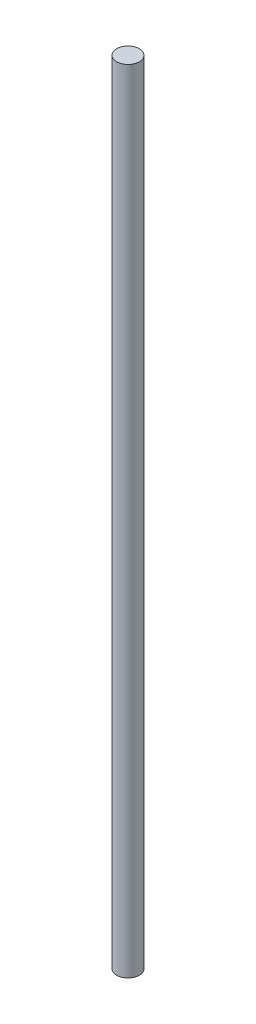
ISO-10303-21;
HEADER;
FILE_DESCRIPTION(('STEP AP214'),'2;1');
FILE_NAME('part.step','',(''),(''),'','','');
FILE_SCHEMA(('AUTOMOTIVE_DESIGN { 1 0 10303 214 1 1 1 1 }'));
ENDSEC;
DATA;
#1=APPLICATION_CONTEXT('core data for automotive mechanical design processes');
#2=APPLICATION_PROTOCOL_DEFINITION('international standard','automotive_design',2000,#1);
#3=PRODUCT_CONTEXT('',#1,'mechanical');
#4=PRODUCT('Part','Part','',(#3));
#5=PRODUCT_RELATED_PRODUCT_CATEGORY('part','',(#4));
#6=PRODUCT_DEFINITION_FORMATION('','',#4);
#7=PRODUCT_DEFINITION_CONTEXT('part definition',#1,'design');
#8=PRODUCT_DEFINITION('design','',#6,#7);
#9=PRODUCT_DEFINITION_SHAPE('','',#8);
#10=(LENGTH_UNIT() NAMED_UNIT(*) SI_UNIT(.MILLI.,.METRE.));
#11=(NAMED_UNIT(*) PLANE_ANGLE_UNIT() SI_UNIT($,.RADIAN.));
#12=(NAMED_UNIT(*) SI_UNIT($,.STERADIAN.) SOLID_ANGLE_UNIT());
#13=UNCERTAINTY_MEASURE_WITH_UNIT(LENGTH_MEASURE(1.E-05),#10,'distance_accuracy_value','');
#14=(GEOMETRIC_REPRESENTATION_CONTEXT(3) GLOBAL_UNCERTAINTY_ASSIGNED_CONTEXT((#13)) GLOBAL_UNIT_ASSIGNED_CONTEXT((#10,
#11,#12)) REPRESENTATION_CONTEXT('',''));
#15=CARTESIAN_POINT('',(0.,0.,0.));
#16=DIRECTION('',(0.,0.,1.));
#17=DIRECTION('',(1.,0.,0.));
#18=AXIS2_PLACEMENT_3D('',#15,#16,#17);
#19=CARTESIAN_POINT('',(0.,280.,0.));
#20=DIRECTION('',(0.,-1.,0.));
#21=DIRECTION('',(0.,0.,-1.));
#22=AXIS2_PLACEMENT_3D('',#19,#20,#21);
#23=CYLINDRICAL_SURFACE('',#22,4.);
#24=CARTESIAN_POINT('',(0.,280.,0.));
#25=DIRECTION('',(0.,1.,0.));
#26=DIRECTION('',(0.,0.,1.));
#27=AXIS2_PLACEMENT_3D('',#24,#25,#26);
#28=CIRCLE('',#27,4.);
#29=CARTESIAN_POINT('',(0.,280.,4.));
#30=VERTEX_POINT('',#29);
#31=EDGE_CURVE('E10',#30,#30,#28,.T.);
#32=ORIENTED_EDGE('',*,*,#31,.F.);
#33=EDGE_LOOP('',(#32));
#34=FACE_BOUND('',#33,.T.);
#35=CARTESIAN_POINT('',(0.,0.,0.));
#36=DIRECTION('',(0.,1.,0.));
#37=DIRECTION('',(0.,0.,1.));
#38=AXIS2_PLACEMENT_3D('',#35,#36,#37);
#39=CIRCLE('',#38,4.);
#40=CARTESIAN_POINT('',(0.,0.,4.));
#41=VERTEX_POINT('',#40);
#42=EDGE_CURVE('E40',#41,#41,#39,.T.);
#43=ORIENTED_EDGE('',*,*,#42,.T.);
#44=EDGE_LOOP('',(#43));
#45=FACE_BOUND('',#44,.T.);
#46=ADVANCED_FACE('F37',(#34,#45),#23,.T.);
#47=CARTESIAN_POINT('',(0.,280.,0.));
#48=DIRECTION('',(0.,1.,0.));
#49=DIRECTION('',(0.,0.,1.));
#50=AXIS2_PLACEMENT_3D('',#47,#48,#49);
#51=PLANE('',#50);
#52=ORIENTED_EDGE('',*,*,#31,.T.);
#53=EDGE_LOOP('',(#52));
#54=FACE_BOUND('',#53,.T.);
#55=ADVANCED_FACE('F52',(#54),#51,.T.);
#56=CARTESIAN_POINT('',(0.,0.,0.));
#57=DIRECTION('',(0.,1.,0.));
#58=DIRECTION('',(0.,0.,1.));
#59=AXIS2_PLACEMENT_3D('',#56,#57,#58);
#60=PLANE('',#59);
#61=ORIENTED_EDGE('',*,*,#42,.F.);
#62=EDGE_LOOP('',(#61));
#63=FACE_BOUND('',#62,.T.);
#64=ADVANCED_FACE('F50',(#63),#60,.F.);
#65=CLOSED_SHELL('',(#46,#55,#64));
#66=MANIFOLD_SOLID_BREP('B2',#65);
#67=ADVANCED_BREP_SHAPE_REPRESENTATION('',(#18,#66),#14);
#68=SHAPE_DEFINITION_REPRESENTATION(#9,#67);
ENDSEC;
END-ISO-10303-21;
